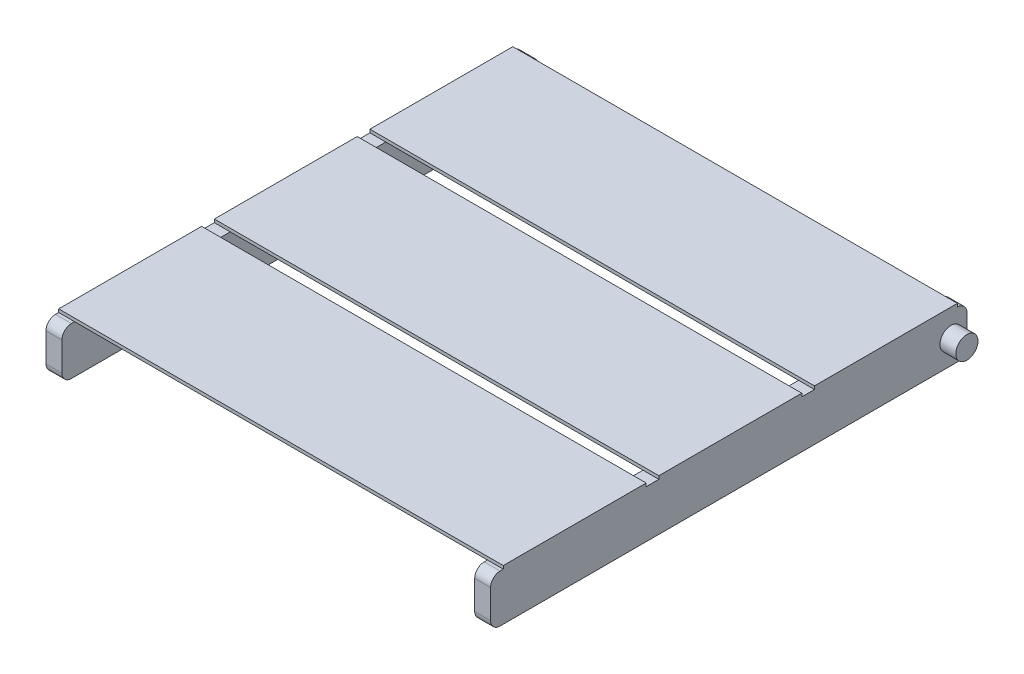
ISO-10303-21;
HEADER;
FILE_DESCRIPTION(('STEP AP214'),'2;1');
FILE_NAME('part.step','',(''),(''),'','','');
FILE_SCHEMA(('AUTOMOTIVE_DESIGN { 1 0 10303 214 1 1 1 1 }'));
ENDSEC;
DATA;
#1=APPLICATION_CONTEXT('core data for automotive mechanical design processes');
#2=APPLICATION_PROTOCOL_DEFINITION('international standard','automotive_design',2000,#1);
#3=PRODUCT_CONTEXT('',#1,'mechanical');
#4=PRODUCT('Part','Part','',(#3));
#5=PRODUCT_RELATED_PRODUCT_CATEGORY('part','',(#4));
#6=PRODUCT_DEFINITION_FORMATION('','',#4);
#7=PRODUCT_DEFINITION_CONTEXT('part definition',#1,'design');
#8=PRODUCT_DEFINITION('design','',#6,#7);
#9=PRODUCT_DEFINITION_SHAPE('','',#8);
#10=(LENGTH_UNIT() NAMED_UNIT(*) SI_UNIT(.MILLI.,.METRE.));
#11=(NAMED_UNIT(*) PLANE_ANGLE_UNIT() SI_UNIT($,.RADIAN.));
#12=(NAMED_UNIT(*) SI_UNIT($,.STERADIAN.) SOLID_ANGLE_UNIT());
#13=UNCERTAINTY_MEASURE_WITH_UNIT(LENGTH_MEASURE(1.E-05),#10,'distance_accuracy_value','');
#14=(GEOMETRIC_REPRESENTATION_CONTEXT(3) GLOBAL_UNCERTAINTY_ASSIGNED_CONTEXT((#13)) GLOBAL_UNIT_ASSIGNED_CONTEXT((#10,
#11,#12)) REPRESENTATION_CONTEXT('',''));
#15=CARTESIAN_POINT('',(0.,0.,0.));
#16=DIRECTION('',(0.,0.,1.));
#17=DIRECTION('',(1.,0.,0.));
#18=AXIS2_PLACEMENT_3D('',#15,#16,#17);
#19=CARTESIAN_POINT('',(50.,75.,720.));
#20=DIRECTION('',(0.,-1.,0.));
#21=DIRECTION('',(0.,0.,-1.));
#22=AXIS2_PLACEMENT_3D('',#19,#20,#21);
#23=PLANE('',#22);
#24=DIRECTION('',(1.,0.,0.));
#25=VECTOR('',#24,1.);
#26=CARTESIAN_POINT('',(1400.,75.,710.));
#27=LINE('',#26,#25);
#28=CARTESIAN_POINT('',(0.,75.,710.));
#29=VERTEX_POINT('',#28);
#30=CARTESIAN_POINT('',(50.,75.,710.000000000001));
#31=VERTEX_POINT('',#30);
#32=EDGE_CURVE('E781',#29,#31,#27,.T.);
#33=ORIENTED_EDGE('',*,*,#32,.F.);
#34=DIRECTION('',(0.,0.,1.));
#35=VECTOR('',#34,1.);
#36=CARTESIAN_POINT('',(0.,75.,720.));
#37=LINE('',#36,#35);
#38=CARTESIAN_POINT('',(0.,75.,720.));
#39=VERTEX_POINT('',#38);
#40=EDGE_CURVE('E280',#29,#39,#37,.T.);
#41=ORIENTED_EDGE('',*,*,#40,.T.);
#42=DIRECTION('',(-1.,0.,0.));
#43=VECTOR('',#42,1.);
#44=CARTESIAN_POINT('',(50.,75.,720.));
#45=LINE('',#44,#43);
#46=CARTESIAN_POINT('',(50.,75.,720.));
#47=VERTEX_POINT('',#46);
#48=EDGE_CURVE('E529',#47,#39,#45,.T.);
#49=ORIENTED_EDGE('',*,*,#48,.F.);
#50=DIRECTION('',(0.,0.,1.));
#51=VECTOR('',#50,1.);
#52=CARTESIAN_POINT('',(50.,75.,720.));
#53=LINE('',#52,#51);
#54=EDGE_CURVE('E57',#31,#47,#53,.T.);
#55=ORIENTED_EDGE('',*,*,#54,.F.);
#56=EDGE_LOOP('',(#33,#41,#49,#55));
#57=FACE_BOUND('',#56,.T.);
#58=ADVANCED_FACE('F41',(#57),#23,.F.);
#59=DIRECTION('',(-1.,0.,0.));
#60=VECTOR('',#59,1.);
#61=CARTESIAN_POINT('',(1400.,75.,260.));
#62=LINE('',#61,#60);
#63=CARTESIAN_POINT('',(50.,75.,260.));
#64=VERTEX_POINT('',#63);
#65=CARTESIAN_POINT('',(0.,75.,260.));
#66=VERTEX_POINT('',#65);
#67=EDGE_CURVE('E65',#64,#66,#62,.T.);
#68=ORIENTED_EDGE('',*,*,#67,.F.);
#69=CARTESIAN_POINT('',(50.,75.,220.000000000001));
#70=VERTEX_POINT('',#69);
#71=EDGE_CURVE('E601',#70,#64,#53,.T.);
#72=ORIENTED_EDGE('',*,*,#71,.F.);
#73=DIRECTION('',(1.,0.,0.));
#74=VECTOR('',#73,1.);
#75=CARTESIAN_POINT('',(1400.,75.,220.));
#76=LINE('',#75,#74);
#77=CARTESIAN_POINT('',(0.,75.,220.));
#78=VERTEX_POINT('',#77);
#79=EDGE_CURVE('E307',#78,#70,#76,.T.);
#80=ORIENTED_EDGE('',*,*,#79,.F.);
#81=EDGE_CURVE('E503',#78,#66,#37,.T.);
#82=ORIENTED_EDGE('',*,*,#81,.T.);
#83=EDGE_LOOP('',(#68,#72,#80,#82));
#84=FACE_BOUND('',#83,.T.);
#85=ADVANCED_FACE('F568',(#84),#23,.F.);
#86=CARTESIAN_POINT('',(1400.,75.,720.));
#87=DIRECTION('',(0.,-1.,0.));
#88=DIRECTION('',(0.,0.,-1.));
#89=AXIS2_PLACEMENT_3D('',#86,#87,#88);
#90=PLANE('',#89);
#91=CARTESIAN_POINT('',(1350.,75.,710.));
#92=VERTEX_POINT('',#91);
#93=CARTESIAN_POINT('',(1400.,75.,710.));
#94=VERTEX_POINT('',#93);
#95=EDGE_CURVE('E774',#92,#94,#27,.T.);
#96=ORIENTED_EDGE('',*,*,#95,.F.);
#97=DIRECTION('',(0.,0.,1.));
#98=VECTOR('',#97,1.);
#99=CARTESIAN_POINT('',(1350.,75.,720.));
#100=LINE('',#99,#98);
#101=CARTESIAN_POINT('',(1350.,75.,720.));
#102=VERTEX_POINT('',#101);
#103=EDGE_CURVE('E378',#92,#102,#100,.T.);
#104=ORIENTED_EDGE('',*,*,#103,.T.);
#105=DIRECTION('',(-1.,0.,0.));
#106=VECTOR('',#105,1.);
#107=CARTESIAN_POINT('',(1400.,75.,720.));
#108=LINE('',#107,#106);
#109=CARTESIAN_POINT('',(1400.,75.,720.));
#110=VERTEX_POINT('',#109);
#111=EDGE_CURVE('E409',#110,#102,#108,.T.);
#112=ORIENTED_EDGE('',*,*,#111,.F.);
#113=DIRECTION('',(0.,0.,1.));
#114=VECTOR('',#113,1.);
#115=CARTESIAN_POINT('',(1400.,75.,720.));
#116=LINE('',#115,#114);
#117=EDGE_CURVE('E349',#94,#110,#116,.T.);
#118=ORIENTED_EDGE('',*,*,#117,.F.);
#119=EDGE_LOOP('',(#96,#104,#112,#118));
#120=FACE_BOUND('',#119,.T.);
#121=ADVANCED_FACE('F574',(#120),#90,.F.);
#122=CARTESIAN_POINT('',(1400.,75.,260.));
#123=VERTEX_POINT('',#122);
#124=CARTESIAN_POINT('',(1350.,75.,260.));
#125=VERTEX_POINT('',#124);
#126=EDGE_CURVE('E275',#123,#125,#62,.T.);
#127=ORIENTED_EDGE('',*,*,#126,.F.);
#128=CARTESIAN_POINT('',(1400.,75.,220.));
#129=VERTEX_POINT('',#128);
#130=EDGE_CURVE('E355',#129,#123,#116,.T.);
#131=ORIENTED_EDGE('',*,*,#130,.F.);
#132=CARTESIAN_POINT('',(1350.,75.,220.));
#133=VERTEX_POINT('',#132);
#134=EDGE_CURVE('E286',#133,#129,#76,.T.);
#135=ORIENTED_EDGE('',*,*,#134,.F.);
#136=EDGE_CURVE('E818',#133,#125,#100,.T.);
#137=ORIENTED_EDGE('',*,*,#136,.T.);
#138=EDGE_LOOP('',(#127,#131,#135,#137));
#139=FACE_BOUND('',#138,.T.);
#140=ADVANCED_FACE('F579',(#139),#90,.F.);
#141=DIRECTION('',(-1.,0.,0.));
#142=VECTOR('',#141,1.);
#143=CARTESIAN_POINT('',(1400.,75.,-230.));
#144=LINE('',#143,#142);
#145=CARTESIAN_POINT('',(50.,75.,-230.));
#146=VERTEX_POINT('',#145);
#147=CARTESIAN_POINT('',(0.,75.,-230.));
#148=VERTEX_POINT('',#147);
#149=EDGE_CURVE('E311',#146,#148,#144,.T.);
#150=ORIENTED_EDGE('',*,*,#149,.F.);
#151=CARTESIAN_POINT('',(50.,75.,-269.999999999999));
#152=VERTEX_POINT('',#151);
#153=EDGE_CURVE('E477',#152,#146,#53,.T.);
#154=ORIENTED_EDGE('',*,*,#153,.F.);
#155=DIRECTION('',(1.,0.,0.));
#156=VECTOR('',#155,1.);
#157=CARTESIAN_POINT('',(1400.,75.,-270.));
#158=LINE('',#157,#156);
#159=CARTESIAN_POINT('',(0.,75.,-270.));
#160=VERTEX_POINT('',#159);
#161=EDGE_CURVE('E437',#160,#152,#158,.T.);
#162=ORIENTED_EDGE('',*,*,#161,.F.);
#163=EDGE_CURVE('E499',#160,#148,#37,.T.);
#164=ORIENTED_EDGE('',*,*,#163,.T.);
#165=EDGE_LOOP('',(#150,#154,#162,#164));
#166=FACE_BOUND('',#165,.T.);
#167=ADVANCED_FACE('F570',(#166),#23,.F.);
#168=CARTESIAN_POINT('',(1400.,75.,-230.));
#169=VERTEX_POINT('',#168);
#170=CARTESIAN_POINT('',(1350.,75.,-230.));
#171=VERTEX_POINT('',#170);
#172=EDGE_CURVE('E297',#169,#171,#144,.T.);
#173=ORIENTED_EDGE('',*,*,#172,.F.);
#174=CARTESIAN_POINT('',(1400.,75.,-270.));
#175=VERTEX_POINT('',#174);
#176=EDGE_CURVE('E350',#175,#169,#116,.T.);
#177=ORIENTED_EDGE('',*,*,#176,.F.);
#178=CARTESIAN_POINT('',(1350.,75.,-270.));
#179=VERTEX_POINT('',#178);
#180=EDGE_CURVE('E421',#179,#175,#158,.T.);
#181=ORIENTED_EDGE('',*,*,#180,.F.);
#182=EDGE_CURVE('E383',#179,#171,#100,.T.);
#183=ORIENTED_EDGE('',*,*,#182,.T.);
#184=EDGE_LOOP('',(#173,#177,#181,#183));
#185=FACE_BOUND('',#184,.T.);
#186=ADVANCED_FACE('F578',(#185),#90,.F.);
#187=CARTESIAN_POINT('',(0.,75.,0.));
#188=DIRECTION('',(0.,1.,0.));
#189=DIRECTION('',(0.,0.,1.));
#190=AXIS2_PLACEMENT_3D('',#187,#188,#189);
#191=PLANE('',#190);
#192=CARTESIAN_POINT('',(1350.,75.,-720.));
#193=VERTEX_POINT('',#192);
#194=EDGE_CURVE('E379',#193,#179,#100,.T.);
#195=ORIENTED_EDGE('',*,*,#194,.T.);
#196=EDGE_CURVE('E442',#152,#179,#158,.T.);
#197=ORIENTED_EDGE('',*,*,#196,.F.);
#198=CARTESIAN_POINT('',(50.,75.,-720.));
#199=VERTEX_POINT('',#198);
#200=EDGE_CURVE('E472',#199,#152,#53,.T.);
#201=ORIENTED_EDGE('',*,*,#200,.F.);
#202=DIRECTION('',(-1.,0.,0.));
#203=VECTOR('',#202,1.);
#204=CARTESIAN_POINT('',(1400.,75.,-720.));
#205=LINE('',#204,#203);
#206=EDGE_CURVE('E441',#193,#199,#205,.T.);
#207=ORIENTED_EDGE('',*,*,#206,.F.);
#208=EDGE_LOOP('',(#195,#197,#201,#207));
#209=FACE_BOUND('',#208,.T.);
#210=ADVANCED_FACE('F585',(#209),#191,.F.);
#211=CARTESIAN_POINT('',(50.,-45.,-720.));
#212=DIRECTION('',(-1.,0.,0.));
#213=DIRECTION('',(0.,0.,1.));
#214=AXIS2_PLACEMENT_3D('',#211,#212,#213);
#215=CYLINDRICAL_SURFACE('',#214,30.);
#216=CARTESIAN_POINT('',(0.,-45.,-720.));
#217=DIRECTION('',(1.,0.,0.));
#218=DIRECTION('',(0.,0.,-1.));
#219=AXIS2_PLACEMENT_3D('',#216,#217,#218);
#220=CIRCLE('',#219,30.);
#221=CARTESIAN_POINT('',(0.,-75.,-720.));
#222=VERTEX_POINT('',#221);
#223=CARTESIAN_POINT('',(0.,-44.9999999999998,-750.));
#224=VERTEX_POINT('',#223);
#225=EDGE_CURVE('E459',#222,#224,#220,.T.);
#226=ORIENTED_EDGE('',*,*,#225,.T.);
#227=DIRECTION('',(-1.,0.,0.));
#228=VECTOR('',#227,1.);
#229=CARTESIAN_POINT('',(50.,-44.9999999999998,-750.));
#230=LINE('',#229,#228);
#231=CARTESIAN_POINT('',(50.,-44.9999999999998,-750.));
#232=VERTEX_POINT('',#231);
#233=EDGE_CURVE('E541',#232,#224,#230,.T.);
#234=ORIENTED_EDGE('',*,*,#233,.F.);
#235=CARTESIAN_POINT('',(50.,-45.,-720.));
#236=DIRECTION('',(1.,0.,0.));
#237=DIRECTION('',(0.,0.,-1.));
#238=AXIS2_PLACEMENT_3D('',#235,#236,#237);
#239=CIRCLE('',#238,30.);
#240=CARTESIAN_POINT('',(50.,-75.,-720.));
#241=VERTEX_POINT('',#240);
#242=EDGE_CURVE('E460',#241,#232,#239,.T.);
#243=ORIENTED_EDGE('',*,*,#242,.F.);
#244=DIRECTION('',(-1.,0.,0.));
#245=VECTOR('',#244,1.);
#246=CARTESIAN_POINT('',(50.,-75.,-720.));
#247=LINE('',#246,#245);
#248=EDGE_CURVE('E489',#241,#222,#247,.T.);
#249=ORIENTED_EDGE('',*,*,#248,.T.);
#250=EDGE_LOOP('',(#226,#234,#243,#249));
#251=FACE_BOUND('',#250,.T.);
#252=ADVANCED_FACE('F43',(#251),#215,.T.);
#253=CARTESIAN_POINT('',(50.,-44.9999999999998,-750.));
#254=DIRECTION('',(0.,0.,1.));
#255=DIRECTION('',(1.,0.,0.));
#256=AXIS2_PLACEMENT_3D('',#253,#254,#255);
#257=PLANE('',#256);
#258=DIRECTION('',(0.,1.,0.));
#259=VECTOR('',#258,1.);
#260=CARTESIAN_POINT('',(0.,-44.9999999999998,-750.));
#261=LINE('',#260,#259);
#262=CARTESIAN_POINT('',(0.,44.9999999999998,-750.));
#263=VERTEX_POINT('',#262);
#264=EDGE_CURVE('E493',#224,#263,#261,.T.);
#265=ORIENTED_EDGE('',*,*,#264,.T.);
#266=DIRECTION('',(-1.,0.,0.));
#267=VECTOR('',#266,1.);
#268=CARTESIAN_POINT('',(50.,44.9999999999998,-750.));
#269=LINE('',#268,#267);
#270=CARTESIAN_POINT('',(50.,44.9999999999998,-750.));
#271=VERTEX_POINT('',#270);
#272=EDGE_CURVE('E537',#271,#263,#269,.T.);
#273=ORIENTED_EDGE('',*,*,#272,.F.);
#274=DIRECTION('',(0.,1.,0.));
#275=VECTOR('',#274,1.);
#276=CARTESIAN_POINT('',(50.,-44.9999999999998,-750.));
#277=LINE('',#276,#275);
#278=EDGE_CURVE('E464',#232,#271,#277,.T.);
#279=ORIENTED_EDGE('',*,*,#278,.F.);
#280=ORIENTED_EDGE('',*,*,#233,.T.);
#281=EDGE_LOOP('',(#265,#273,#279,#280));
#282=FACE_BOUND('',#281,.T.);
#283=ADVANCED_FACE('F660',(#282),#257,.F.);
#284=CARTESIAN_POINT('',(50.,45.,-720.));
#285=DIRECTION('',(-1.,0.,0.));
#286=DIRECTION('',(0.,0.,1.));
#287=AXIS2_PLACEMENT_3D('',#284,#285,#286);
#288=CYLINDRICAL_SURFACE('',#287,30.);
#289=CARTESIAN_POINT('',(0.,45.,-720.));
#290=DIRECTION('',(1.,0.,0.));
#291=DIRECTION('',(0.,0.,1.));
#292=AXIS2_PLACEMENT_3D('',#289,#290,#291);
#293=CIRCLE('',#292,30.);
#294=CARTESIAN_POINT('',(0.,75.,-720.));
#295=VERTEX_POINT('',#294);
#296=EDGE_CURVE('E496',#263,#295,#293,.T.);
#297=ORIENTED_EDGE('',*,*,#296,.T.);
#298=DIRECTION('',(-1.,0.,0.));
#299=VECTOR('',#298,1.);
#300=CARTESIAN_POINT('',(50.,75.,-720.));
#301=LINE('',#300,#299);
#302=EDGE_CURVE('E533',#199,#295,#301,.T.);
#303=ORIENTED_EDGE('',*,*,#302,.F.);
#304=CARTESIAN_POINT('',(50.,45.,-720.));
#305=DIRECTION('',(1.,0.,0.));
#306=DIRECTION('',(0.,0.,1.));
#307=AXIS2_PLACEMENT_3D('',#304,#305,#306);
#308=CIRCLE('',#307,30.);
#309=EDGE_CURVE('E468',#271,#199,#308,.T.);
#310=ORIENTED_EDGE('',*,*,#309,.F.);
#311=ORIENTED_EDGE('',*,*,#272,.T.);
#312=EDGE_LOOP('',(#297,#303,#310,#311));
#313=FACE_BOUND('',#312,.T.);
#314=ADVANCED_FACE('F663',(#313),#288,.T.);
#315=CARTESIAN_POINT('',(50.,45.,720.));
#316=DIRECTION('',(-1.,0.,0.));
#317=DIRECTION('',(0.,0.,1.));
#318=AXIS2_PLACEMENT_3D('',#315,#316,#317);
#319=CYLINDRICAL_SURFACE('',#318,30.);
#320=CARTESIAN_POINT('',(0.,45.,720.));
#321=DIRECTION('',(1.,0.,0.));
#322=DIRECTION('',(0.,0.,1.));
#323=AXIS2_PLACEMENT_3D('',#320,#321,#322);
#324=CIRCLE('',#323,30.);
#325=CARTESIAN_POINT('',(0.,44.9999999999998,750.));
#326=VERTEX_POINT('',#325);
#327=EDGE_CURVE('E502',#39,#326,#324,.T.);
#328=ORIENTED_EDGE('',*,*,#327,.T.);
#329=DIRECTION('',(-1.,0.,0.));
#330=VECTOR('',#329,1.);
#331=CARTESIAN_POINT('',(50.,44.9999999999998,750.));
#332=LINE('',#331,#330);
#333=CARTESIAN_POINT('',(50.,44.9999999999998,750.));
#334=VERTEX_POINT('',#333);
#335=EDGE_CURVE('E525',#334,#326,#332,.T.);
#336=ORIENTED_EDGE('',*,*,#335,.F.);
#337=CARTESIAN_POINT('',(50.,45.,720.));
#338=DIRECTION('',(1.,0.,0.));
#339=DIRECTION('',(0.,0.,1.));
#340=AXIS2_PLACEMENT_3D('',#337,#338,#339);
#341=CIRCLE('',#340,30.);
#342=EDGE_CURVE('E476',#47,#334,#341,.T.);
#343=ORIENTED_EDGE('',*,*,#342,.F.);
#344=ORIENTED_EDGE('',*,*,#48,.T.);
#345=EDGE_LOOP('',(#328,#336,#343,#344));
#346=FACE_BOUND('',#345,.T.);
#347=ADVANCED_FACE('F638',(#346),#319,.T.);
#348=CARTESIAN_POINT('',(50.,-44.9999999999998,750.));
#349=DIRECTION('',(0.,0.,-1.));
#350=DIRECTION('',(-1.,0.,0.));
#351=AXIS2_PLACEMENT_3D('',#348,#349,#350);
#352=PLANE('',#351);
#353=DIRECTION('',(0.,-1.,0.));
#354=VECTOR('',#353,1.);
#355=CARTESIAN_POINT('',(0.,-44.9999999999998,750.));
#356=LINE('',#355,#354);
#357=CARTESIAN_POINT('',(0.,-45.,750.));
#358=VERTEX_POINT('',#357);
#359=EDGE_CURVE('E506',#326,#358,#356,.T.);
#360=ORIENTED_EDGE('',*,*,#359,.T.);
#361=DIRECTION('',(-1.,0.,0.));
#362=VECTOR('',#361,1.);
#363=CARTESIAN_POINT('',(50.,-45.,750.));
#364=LINE('',#363,#362);
#365=CARTESIAN_POINT('',(50.,-45.,750.));
#366=VERTEX_POINT('',#365);
#367=EDGE_CURVE('E521',#366,#358,#364,.T.);
#368=ORIENTED_EDGE('',*,*,#367,.F.);
#369=DIRECTION('',(0.,-1.,0.));
#370=VECTOR('',#369,1.);
#371=CARTESIAN_POINT('',(50.,-44.9999999999998,750.));
#372=LINE('',#371,#370);
#373=EDGE_CURVE('E480',#334,#366,#372,.T.);
#374=ORIENTED_EDGE('',*,*,#373,.F.);
#375=ORIENTED_EDGE('',*,*,#335,.T.);
#376=EDGE_LOOP('',(#360,#368,#374,#375));
#377=FACE_BOUND('',#376,.T.);
#378=ADVANCED_FACE('F643',(#377),#352,.F.);
#379=CARTESIAN_POINT('',(50.,-45.,720.));
#380=DIRECTION('',(-1.,0.,0.));
#381=DIRECTION('',(0.,0.,1.));
#382=AXIS2_PLACEMENT_3D('',#379,#380,#381);
#383=CYLINDRICAL_SURFACE('',#382,30.);
#384=CARTESIAN_POINT('',(0.,-45.,720.));
#385=DIRECTION('',(1.,0.,0.));
#386=DIRECTION('',(0.,0.,1.));
#387=AXIS2_PLACEMENT_3D('',#384,#385,#386);
#388=CIRCLE('',#387,30.);
#389=CARTESIAN_POINT('',(0.,-75.,720.));
#390=VERTEX_POINT('',#389);
#391=EDGE_CURVE('E509',#358,#390,#388,.T.);
#392=ORIENTED_EDGE('',*,*,#391,.T.);
#393=DIRECTION('',(-1.,0.,0.));
#394=VECTOR('',#393,1.);
#395=CARTESIAN_POINT('',(50.,-75.,720.));
#396=LINE('',#395,#394);
#397=CARTESIAN_POINT('',(50.,-75.,720.));
#398=VERTEX_POINT('',#397);
#399=EDGE_CURVE('E517',#398,#390,#396,.T.);
#400=ORIENTED_EDGE('',*,*,#399,.F.);
#401=CARTESIAN_POINT('',(50.,-45.,720.));
#402=DIRECTION('',(1.,0.,0.));
#403=DIRECTION('',(0.,0.,1.));
#404=AXIS2_PLACEMENT_3D('',#401,#402,#403);
#405=CIRCLE('',#404,30.);
#406=EDGE_CURVE('E483',#366,#398,#405,.T.);
#407=ORIENTED_EDGE('',*,*,#406,.F.);
#408=ORIENTED_EDGE('',*,*,#367,.T.);
#409=EDGE_LOOP('',(#392,#400,#407,#408));
#410=FACE_BOUND('',#409,.T.);
#411=ADVANCED_FACE('F649',(#410),#383,.T.);
#412=CARTESIAN_POINT('',(50.,-75.,720.));
#413=DIRECTION('',(0.,1.,0.));
#414=DIRECTION('',(0.,0.,1.));
#415=AXIS2_PLACEMENT_3D('',#412,#413,#414);
#416=PLANE('',#415);
#417=DIRECTION('',(0.,0.,-1.));
#418=VECTOR('',#417,1.);
#419=CARTESIAN_POINT('',(0.,-75.,720.));
#420=LINE('',#419,#418);
#421=EDGE_CURVE('E465',#390,#222,#420,.T.);
#422=ORIENTED_EDGE('',*,*,#421,.T.);
#423=ORIENTED_EDGE('',*,*,#248,.F.);
#424=DIRECTION('',(0.,0.,-1.));
#425=VECTOR('',#424,1.);
#426=CARTESIAN_POINT('',(50.,-75.,720.));
#427=LINE('',#426,#425);
#428=EDGE_CURVE('E486',#398,#241,#427,.T.);
#429=ORIENTED_EDGE('',*,*,#428,.F.);
#430=ORIENTED_EDGE('',*,*,#399,.T.);
#431=EDGE_LOOP('',(#422,#423,#429,#430));
#432=FACE_BOUND('',#431,.T.);
#433=ADVANCED_FACE('F563',(#432),#416,.F.);
#434=CARTESIAN_POINT('',(50.,-45.,-720.));
#435=DIRECTION('',(1.,0.,0.));
#436=DIRECTION('',(0.,0.,-1.));
#437=AXIS2_PLACEMENT_3D('',#434,#435,#436);
#438=PLANE('',#437);
#439=ORIENTED_EDGE('',*,*,#242,.T.);
#440=ORIENTED_EDGE('',*,*,#278,.T.);
#441=ORIENTED_EDGE('',*,*,#309,.T.);
#442=ORIENTED_EDGE('',*,*,#200,.T.);
#443=ORIENTED_EDGE('',*,*,#153,.T.);
#444=DIRECTION('',(0.,0.,1.));
#445=VECTOR('',#444,1.);
#446=CARTESIAN_POINT('',(50.,75.,-720.));
#447=LINE('',#446,#445);
#448=EDGE_CURVE('E332',#146,#70,#447,.T.);
#449=ORIENTED_EDGE('',*,*,#448,.T.);
#450=ORIENTED_EDGE('',*,*,#71,.T.);
#451=DIRECTION('',(0.,0.,1.));
#452=VECTOR('',#451,1.);
#453=CARTESIAN_POINT('',(50.,75.,-720.));
#454=LINE('',#453,#452);
#455=EDGE_CURVE('E282',#64,#31,#454,.T.);
#456=ORIENTED_EDGE('',*,*,#455,.T.);
#457=ORIENTED_EDGE('',*,*,#54,.T.);
#458=ORIENTED_EDGE('',*,*,#342,.T.);
#459=ORIENTED_EDGE('',*,*,#373,.T.);
#460=ORIENTED_EDGE('',*,*,#406,.T.);
#461=ORIENTED_EDGE('',*,*,#428,.T.);
#462=EDGE_LOOP('',(#439,#440,#441,#442,#443,#449,#450,#456,#457,#458,#459,#460,#461));
#463=FACE_BOUND('',#462,.T.);
#464=ADVANCED_FACE('F552',(#463),#438,.T.);
#465=CARTESIAN_POINT('',(0.,-45.,-720.));
#466=DIRECTION('',(1.,0.,0.));
#467=DIRECTION('',(0.,0.,-1.));
#468=AXIS2_PLACEMENT_3D('',#465,#466,#467);
#469=PLANE('',#468);
#470=CARTESIAN_POINT('',(0.,0.,-700.));
#471=DIRECTION('',(1.,0.,0.));
#472=DIRECTION('',(0.,0.,-1.));
#473=AXIS2_PLACEMENT_3D('',#470,#471,#472);
#474=CIRCLE('',#473,35.);
#475=CARTESIAN_POINT('',(0.,0.,-735.));
#476=VERTEX_POINT('',#475);
#477=EDGE_CURVE('E50',#476,#476,#474,.F.);
#478=ORIENTED_EDGE('',*,*,#477,.F.);
#479=EDGE_LOOP('',(#478));
#480=FACE_BOUND('',#479,.T.);
#481=ORIENTED_EDGE('',*,*,#225,.F.);
#482=ORIENTED_EDGE('',*,*,#421,.F.);
#483=ORIENTED_EDGE('',*,*,#391,.F.);
#484=ORIENTED_EDGE('',*,*,#359,.F.);
#485=ORIENTED_EDGE('',*,*,#327,.F.);
#486=ORIENTED_EDGE('',*,*,#40,.F.);
#487=DIRECTION('',(0.,-1.,0.));
#488=VECTOR('',#487,1.);
#489=CARTESIAN_POINT('',(0.,85.,710.));
#490=LINE('',#489,#488);
#491=CARTESIAN_POINT('',(0.,85.,710.));
#492=VERTEX_POINT('',#491);
#493=EDGE_CURVE('E257',#492,#29,#490,.T.);
#494=ORIENTED_EDGE('',*,*,#493,.F.);
#495=DIRECTION('',(0.,0.,1.));
#496=VECTOR('',#495,1.);
#497=CARTESIAN_POINT('',(0.,85.,710.));
#498=LINE('',#497,#496);
#499=CARTESIAN_POINT('',(0.,85.,260.));
#500=VERTEX_POINT('',#499);
#501=EDGE_CURVE('E265',#500,#492,#498,.T.);
#502=ORIENTED_EDGE('',*,*,#501,.F.);
#503=DIRECTION('',(0.,-1.,0.));
#504=VECTOR('',#503,1.);
#505=CARTESIAN_POINT('',(0.,85.,260.));
#506=LINE('',#505,#504);
#507=EDGE_CURVE('E629',#500,#66,#506,.T.);
#508=ORIENTED_EDGE('',*,*,#507,.T.);
#509=ORIENTED_EDGE('',*,*,#81,.F.);
#510=DIRECTION('',(0.,-1.,0.));
#511=VECTOR('',#510,1.);
#512=CARTESIAN_POINT('',(0.,85.,220.));
#513=LINE('',#512,#511);
#514=CARTESIAN_POINT('',(0.,85.,220.));
#515=VERTEX_POINT('',#514);
#516=EDGE_CURVE('E328',#515,#78,#513,.T.);
#517=ORIENTED_EDGE('',*,*,#516,.F.);
#518=DIRECTION('',(0.,0.,1.));
#519=VECTOR('',#518,1.);
#520=CARTESIAN_POINT('',(0.,85.,220.));
#521=LINE('',#520,#519);
#522=CARTESIAN_POINT('',(0.,85.,-230.));
#523=VERTEX_POINT('',#522);
#524=EDGE_CURVE('E292',#523,#515,#521,.T.);
#525=ORIENTED_EDGE('',*,*,#524,.F.);
#526=DIRECTION('',(0.,-1.,0.));
#527=VECTOR('',#526,1.);
#528=CARTESIAN_POINT('',(0.,85.,-230.));
#529=LINE('',#528,#527);
#530=EDGE_CURVE('E306',#523,#148,#529,.T.);
#531=ORIENTED_EDGE('',*,*,#530,.T.);
#532=ORIENTED_EDGE('',*,*,#163,.F.);
#533=DIRECTION('',(0.,-1.,0.));
#534=VECTOR('',#533,1.);
#535=CARTESIAN_POINT('',(0.,85.,-270.));
#536=LINE('',#535,#534);
#537=CARTESIAN_POINT('',(0.,85.,-270.));
#538=VERTEX_POINT('',#537);
#539=EDGE_CURVE('E455',#538,#160,#536,.T.);
#540=ORIENTED_EDGE('',*,*,#539,.F.);
#541=DIRECTION('',(0.,0.,1.));
#542=VECTOR('',#541,1.);
#543=CARTESIAN_POINT('',(0.,85.,-270.));
#544=LINE('',#543,#542);
#545=CARTESIAN_POINT('',(0.,85.,-720.));
#546=VERTEX_POINT('',#545);
#547=EDGE_CURVE('E422',#546,#538,#544,.T.);
#548=ORIENTED_EDGE('',*,*,#547,.F.);
#549=DIRECTION('',(0.,-1.,0.));
#550=VECTOR('',#549,1.);
#551=CARTESIAN_POINT('',(0.,85.,-720.));
#552=LINE('',#551,#550);
#553=EDGE_CURVE('E436',#546,#295,#552,.T.);
#554=ORIENTED_EDGE('',*,*,#553,.T.);
#555=ORIENTED_EDGE('',*,*,#296,.F.);
#556=ORIENTED_EDGE('',*,*,#264,.F.);
#557=EDGE_LOOP('',(#481,#482,#483,#484,#485,#486,#494,#502,#508,#509,#517,#525,#531,#532,#540,
#548,#554,#555,#556));
#558=FACE_BOUND('',#557,.T.);
#559=ADVANCED_FACE('F278',(#480,#558),#469,.F.);
#560=CARTESIAN_POINT('',(1400.,85.,-270.));
#561=DIRECTION('',(0.,0.,-1.));
#562=DIRECTION('',(-1.,0.,0.));
#563=AXIS2_PLACEMENT_3D('',#560,#561,#562);
#564=PLANE('',#563);
#565=ORIENTED_EDGE('',*,*,#161,.T.);
#566=ORIENTED_EDGE('',*,*,#196,.T.);
#567=ORIENTED_EDGE('',*,*,#180,.T.);
#568=DIRECTION('',(0.,-1.,0.));
#569=VECTOR('',#568,1.);
#570=CARTESIAN_POINT('',(1400.,85.,-270.));
#571=LINE('',#570,#569);
#572=CARTESIAN_POINT('',(1400.,85.,-270.));
#573=VERTEX_POINT('',#572);
#574=EDGE_CURVE('E451',#573,#175,#571,.T.);
#575=ORIENTED_EDGE('',*,*,#574,.F.);
#576=DIRECTION('',(1.,0.,0.));
#577=VECTOR('',#576,1.);
#578=CARTESIAN_POINT('',(1400.,85.,-270.));
#579=LINE('',#578,#577);
#580=EDGE_CURVE('E426',#538,#573,#579,.T.);
#581=ORIENTED_EDGE('',*,*,#580,.F.);
#582=ORIENTED_EDGE('',*,*,#539,.T.);
#583=EDGE_LOOP('',(#565,#566,#567,#575,#581,#582));
#584=FACE_BOUND('',#583,.T.);
#585=ADVANCED_FACE('F551',(#584),#564,.F.);
#586=CARTESIAN_POINT('',(1400.,85.,-270.));
#587=DIRECTION('',(-1.,0.,0.));
#588=DIRECTION('',(0.,0.,1.));
#589=AXIS2_PLACEMENT_3D('',#586,#587,#588);
#590=PLANE('',#589);
#591=CARTESIAN_POINT('',(1400.,0.,-700.));
#592=DIRECTION('',(-1.,0.,0.));
#593=DIRECTION('',(0.,0.,1.));
#594=AXIS2_PLACEMENT_3D('',#591,#592,#593);
#595=CIRCLE('',#594,35.);
#596=CARTESIAN_POINT('',(1400.,0.,-665.));
#597=VERTEX_POINT('',#596);
#598=EDGE_CURVE('E11',#597,#597,#595,.F.);
#599=ORIENTED_EDGE('',*,*,#598,.F.);
#600=EDGE_LOOP('',(#599));
#601=FACE_BOUND('',#600,.T.);
#602=ORIENTED_EDGE('',*,*,#574,.T.);
#603=ORIENTED_EDGE('',*,*,#176,.T.);
#604=DIRECTION('',(0.,-1.,0.));
#605=VECTOR('',#604,1.);
#606=CARTESIAN_POINT('',(1400.,85.,-230.));
#607=LINE('',#606,#605);
#608=CARTESIAN_POINT('',(1400.,85.,-230.));
#609=VERTEX_POINT('',#608);
#610=EDGE_CURVE('E320',#609,#169,#607,.T.);
#611=ORIENTED_EDGE('',*,*,#610,.F.);
#612=DIRECTION('',(0.,0.,-1.));
#613=VECTOR('',#612,1.);
#614=CARTESIAN_POINT('',(1400.,85.,220.));
#615=LINE('',#614,#613);
#616=CARTESIAN_POINT('',(1400.,85.,220.));
#617=VERTEX_POINT('',#616);
#618=EDGE_CURVE('E300',#617,#609,#615,.T.);
#619=ORIENTED_EDGE('',*,*,#618,.F.);
#620=DIRECTION('',(0.,-1.,0.));
#621=VECTOR('',#620,1.);
#622=CARTESIAN_POINT('',(1400.,85.,220.));
#623=LINE('',#622,#621);
#624=EDGE_CURVE('E324',#617,#129,#623,.T.);
#625=ORIENTED_EDGE('',*,*,#624,.T.);
#626=ORIENTED_EDGE('',*,*,#130,.T.);
#627=DIRECTION('',(0.,-1.,0.));
#628=VECTOR('',#627,1.);
#629=CARTESIAN_POINT('',(1400.,85.,260.));
#630=LINE('',#629,#628);
#631=CARTESIAN_POINT('',(1400.,85.,260.));
#632=VERTEX_POINT('',#631);
#633=EDGE_CURVE('E288',#632,#123,#630,.T.);
#634=ORIENTED_EDGE('',*,*,#633,.F.);
#635=DIRECTION('',(0.,0.,-1.));
#636=VECTOR('',#635,1.);
#637=CARTESIAN_POINT('',(1400.,85.,710.));
#638=LINE('',#637,#636);
#639=CARTESIAN_POINT('',(1400.,85.,710.));
#640=VERTEX_POINT('',#639);
#641=EDGE_CURVE('E264',#640,#632,#638,.T.);
#642=ORIENTED_EDGE('',*,*,#641,.F.);
#643=DIRECTION('',(0.,-1.,0.));
#644=VECTOR('',#643,1.);
#645=CARTESIAN_POINT('',(1400.,85.,710.));
#646=LINE('',#645,#644);
#647=EDGE_CURVE('E260',#640,#94,#646,.T.);
#648=ORIENTED_EDGE('',*,*,#647,.T.);
#649=ORIENTED_EDGE('',*,*,#117,.T.);
#650=CARTESIAN_POINT('',(1400.,45.,720.));
#651=DIRECTION('',(1.,0.,0.));
#652=DIRECTION('',(0.,0.,1.));
#653=AXIS2_PLACEMENT_3D('',#650,#651,#652);
#654=CIRCLE('',#653,30.);
#655=CARTESIAN_POINT('',(1400.,44.9999999999998,750.));
#656=VERTEX_POINT('',#655);
#657=EDGE_CURVE('E354',#110,#656,#654,.T.);
#658=ORIENTED_EDGE('',*,*,#657,.T.);
#659=DIRECTION('',(0.,-1.,0.));
#660=VECTOR('',#659,1.);
#661=CARTESIAN_POINT('',(1400.,-44.9999999999998,750.));
#662=LINE('',#661,#660);
#663=CARTESIAN_POINT('',(1400.,-45.,750.));
#664=VERTEX_POINT('',#663);
#665=EDGE_CURVE('E358',#656,#664,#662,.T.);
#666=ORIENTED_EDGE('',*,*,#665,.T.);
#667=CARTESIAN_POINT('',(1400.,-45.,720.));
#668=DIRECTION('',(1.,0.,0.));
#669=DIRECTION('',(0.,0.,1.));
#670=AXIS2_PLACEMENT_3D('',#667,#668,#669);
#671=CIRCLE('',#670,30.);
#672=CARTESIAN_POINT('',(1400.,-75.,720.));
#673=VERTEX_POINT('',#672);
#674=EDGE_CURVE('E361',#664,#673,#671,.T.);
#675=ORIENTED_EDGE('',*,*,#674,.T.);
#676=DIRECTION('',(0.,0.,-1.));
#677=VECTOR('',#676,1.);
#678=CARTESIAN_POINT('',(1400.,-75.,720.));
#679=LINE('',#678,#677);
#680=CARTESIAN_POINT('',(1400.,-75.,-720.));
#681=VERTEX_POINT('',#680);
#682=EDGE_CURVE('E364',#673,#681,#679,.T.);
#683=ORIENTED_EDGE('',*,*,#682,.T.);
#684=CARTESIAN_POINT('',(1400.,-45.,-720.));
#685=DIRECTION('',(1.,0.,0.));
#686=DIRECTION('',(0.,0.,-1.));
#687=AXIS2_PLACEMENT_3D('',#684,#685,#686);
#688=CIRCLE('',#687,30.);
#689=CARTESIAN_POINT('',(1400.,-44.9999999999998,-750.));
#690=VERTEX_POINT('',#689);
#691=EDGE_CURVE('E337',#681,#690,#688,.T.);
#692=ORIENTED_EDGE('',*,*,#691,.T.);
#693=DIRECTION('',(0.,1.,0.));
#694=VECTOR('',#693,1.);
#695=CARTESIAN_POINT('',(1400.,-44.9999999999998,-750.));
#696=LINE('',#695,#694);
#697=CARTESIAN_POINT('',(1400.,44.9999999999998,-750.));
#698=VERTEX_POINT('',#697);
#699=EDGE_CURVE('E341',#690,#698,#696,.T.);
#700=ORIENTED_EDGE('',*,*,#699,.T.);
#701=CARTESIAN_POINT('',(1400.,45.,-720.));
#702=DIRECTION('',(1.,0.,0.));
#703=DIRECTION('',(0.,0.,1.));
#704=AXIS2_PLACEMENT_3D('',#701,#702,#703);
#705=CIRCLE('',#704,30.);
#706=CARTESIAN_POINT('',(1400.,75.,-720.));
#707=VERTEX_POINT('',#706);
#708=EDGE_CURVE('E345',#698,#707,#705,.T.);
#709=ORIENTED_EDGE('',*,*,#708,.T.);
#710=DIRECTION('',(0.,-1.,0.));
#711=VECTOR('',#710,1.);
#712=CARTESIAN_POINT('',(1400.,85.,-720.));
#713=LINE('',#712,#711);
#714=CARTESIAN_POINT('',(1400.,85.,-720.));
#715=VERTEX_POINT('',#714);
#716=EDGE_CURVE('E448',#715,#707,#713,.T.);
#717=ORIENTED_EDGE('',*,*,#716,.F.);
#718=DIRECTION('',(0.,0.,-1.));
#719=VECTOR('',#718,1.);
#720=CARTESIAN_POINT('',(1400.,85.,-270.));
#721=LINE('',#720,#719);
#722=EDGE_CURVE('E430',#573,#715,#721,.T.);
#723=ORIENTED_EDGE('',*,*,#722,.F.);
#724=EDGE_LOOP('',(#602,#603,#611,#619,#625,#626,#634,#642,#648,#649,#658,#666,#675,#683,#692,
#700,#709,#717,#723));
#725=FACE_BOUND('',#724,.T.);
#726=ADVANCED_FACE('F559',(#601,#725),#590,.F.);
#727=CARTESIAN_POINT('',(1400.,85.,-720.));
#728=DIRECTION('',(0.,0.,1.));
#729=DIRECTION('',(1.,0.,0.));
#730=AXIS2_PLACEMENT_3D('',#727,#728,#729);
#731=PLANE('',#730);
#732=EDGE_CURVE('E427',#707,#193,#205,.T.);
#733=ORIENTED_EDGE('',*,*,#732,.T.);
#734=ORIENTED_EDGE('',*,*,#206,.T.);
#735=ORIENTED_EDGE('',*,*,#302,.T.);
#736=ORIENTED_EDGE('',*,*,#553,.F.);
#737=DIRECTION('',(-1.,0.,0.));
#738=VECTOR('',#737,1.);
#739=CARTESIAN_POINT('',(1400.,85.,-720.));
#740=LINE('',#739,#738);
#741=EDGE_CURVE('E433',#715,#546,#740,.T.);
#742=ORIENTED_EDGE('',*,*,#741,.F.);
#743=ORIENTED_EDGE('',*,*,#716,.T.);
#744=EDGE_LOOP('',(#733,#734,#735,#736,#742,#743));
#745=FACE_BOUND('',#744,.T.);
#746=ADVANCED_FACE('F680',(#745),#731,.F.);
#747=CARTESIAN_POINT('',(0.,85.,0.));
#748=DIRECTION('',(0.,1.,0.));
#749=DIRECTION('',(0.,0.,1.));
#750=AXIS2_PLACEMENT_3D('',#747,#748,#749);
#751=PLANE('',#750);
#752=ORIENTED_EDGE('',*,*,#547,.T.);
#753=ORIENTED_EDGE('',*,*,#580,.T.);
#754=ORIENTED_EDGE('',*,*,#722,.T.);
#755=ORIENTED_EDGE('',*,*,#741,.T.);
#756=EDGE_LOOP('',(#752,#753,#754,#755));
#757=FACE_BOUND('',#756,.T.);
#758=ADVANCED_FACE('F676',(#757),#751,.T.);
#759=CARTESIAN_POINT('',(1400.,-45.,-720.));
#760=DIRECTION('',(-1.,0.,0.));
#761=DIRECTION('',(0.,0.,1.));
#762=AXIS2_PLACEMENT_3D('',#759,#760,#761);
#763=CYLINDRICAL_SURFACE('',#762,30.);
#764=CARTESIAN_POINT('',(1350.,-45.,-720.));
#765=DIRECTION('',(1.,0.,0.));
#766=DIRECTION('',(0.,0.,-1.));
#767=AXIS2_PLACEMENT_3D('',#764,#765,#766);
#768=CIRCLE('',#767,30.);
#769=CARTESIAN_POINT('',(1350.,-75.,-720.));
#770=VERTEX_POINT('',#769);
#771=CARTESIAN_POINT('',(1350.,-44.9999999999998,-750.));
#772=VERTEX_POINT('',#771);
#773=EDGE_CURVE('E336',#770,#772,#768,.T.);
#774=ORIENTED_EDGE('',*,*,#773,.T.);
#775=DIRECTION('',(-1.,0.,0.));
#776=VECTOR('',#775,1.);
#777=CARTESIAN_POINT('',(1400.,-44.9999999999998,-750.));
#778=LINE('',#777,#776);
#779=EDGE_CURVE('E417',#690,#772,#778,.T.);
#780=ORIENTED_EDGE('',*,*,#779,.F.);
#781=ORIENTED_EDGE('',*,*,#691,.F.);
#782=DIRECTION('',(-1.,0.,0.));
#783=VECTOR('',#782,1.);
#784=CARTESIAN_POINT('',(1400.,-75.,-720.));
#785=LINE('',#784,#783);
#786=EDGE_CURVE('E367',#681,#770,#785,.T.);
#787=ORIENTED_EDGE('',*,*,#786,.T.);
#788=EDGE_LOOP('',(#774,#780,#781,#787));
#789=FACE_BOUND('',#788,.T.);
#790=ADVANCED_FACE('F688',(#789),#763,.T.);
#791=CARTESIAN_POINT('',(1400.,-44.9999999999998,-750.));
#792=DIRECTION('',(0.,0.,1.));
#793=DIRECTION('',(1.,0.,0.));
#794=AXIS2_PLACEMENT_3D('',#791,#792,#793);
#795=PLANE('',#794);
#796=DIRECTION('',(0.,1.,0.));
#797=VECTOR('',#796,1.);
#798=CARTESIAN_POINT('',(1350.,-44.9999999999998,-750.));
#799=LINE('',#798,#797);
#800=CARTESIAN_POINT('',(1350.,44.9999999999998,-750.));
#801=VERTEX_POINT('',#800);
#802=EDGE_CURVE('E371',#772,#801,#799,.T.);
#803=ORIENTED_EDGE('',*,*,#802,.T.);
#804=DIRECTION('',(-1.,0.,0.));
#805=VECTOR('',#804,1.);
#806=CARTESIAN_POINT('',(1400.,44.9999999999998,-750.));
#807=LINE('',#806,#805);
#808=EDGE_CURVE('E413',#698,#801,#807,.T.);
#809=ORIENTED_EDGE('',*,*,#808,.F.);
#810=ORIENTED_EDGE('',*,*,#699,.F.);
#811=ORIENTED_EDGE('',*,*,#779,.T.);
#812=EDGE_LOOP('',(#803,#809,#810,#811));
#813=FACE_BOUND('',#812,.T.);
#814=ADVANCED_FACE('F698',(#813),#795,.F.);
#815=CARTESIAN_POINT('',(1400.,45.,-720.));
#816=DIRECTION('',(-1.,0.,0.));
#817=DIRECTION('',(0.,0.,1.));
#818=AXIS2_PLACEMENT_3D('',#815,#816,#817);
#819=CYLINDRICAL_SURFACE('',#818,30.);
#820=CARTESIAN_POINT('',(1350.,45.,-720.));
#821=DIRECTION('',(1.,0.,0.));
#822=DIRECTION('',(0.,0.,1.));
#823=AXIS2_PLACEMENT_3D('',#820,#821,#822);
#824=CIRCLE('',#823,30.);
#825=EDGE_CURVE('E374',#801,#193,#824,.T.);
#826=ORIENTED_EDGE('',*,*,#825,.T.);
#827=ORIENTED_EDGE('',*,*,#732,.F.);
#828=ORIENTED_EDGE('',*,*,#708,.F.);
#829=ORIENTED_EDGE('',*,*,#808,.T.);
#830=EDGE_LOOP('',(#826,#827,#828,#829));
#831=FACE_BOUND('',#830,.T.);
#832=ADVANCED_FACE('F702',(#831),#819,.T.);
#833=CARTESIAN_POINT('',(1400.,45.,720.));
#834=DIRECTION('',(-1.,0.,0.));
#835=DIRECTION('',(0.,0.,1.));
#836=AXIS2_PLACEMENT_3D('',#833,#834,#835);
#837=CYLINDRICAL_SURFACE('',#836,30.);
#838=CARTESIAN_POINT('',(1350.,45.,720.));
#839=DIRECTION('',(1.,0.,0.));
#840=DIRECTION('',(0.,0.,1.));
#841=AXIS2_PLACEMENT_3D('',#838,#839,#840);
#842=CIRCLE('',#841,30.);
#843=CARTESIAN_POINT('',(1350.,44.9999999999998,750.));
#844=VERTEX_POINT('',#843);
#845=EDGE_CURVE('E382',#102,#844,#842,.T.);
#846=ORIENTED_EDGE('',*,*,#845,.T.);
#847=DIRECTION('',(-1.,0.,0.));
#848=VECTOR('',#847,1.);
#849=CARTESIAN_POINT('',(1400.,44.9999999999998,750.));
#850=LINE('',#849,#848);
#851=EDGE_CURVE('E405',#656,#844,#850,.T.);
#852=ORIENTED_EDGE('',*,*,#851,.F.);
#853=ORIENTED_EDGE('',*,*,#657,.F.);
#854=ORIENTED_EDGE('',*,*,#111,.T.);
#855=EDGE_LOOP('',(#846,#852,#853,#854));
#856=FACE_BOUND('',#855,.T.);
#857=ADVANCED_FACE('F705',(#856),#837,.T.);
#858=CARTESIAN_POINT('',(1400.,-44.9999999999998,750.));
#859=DIRECTION('',(0.,0.,-1.));
#860=DIRECTION('',(-1.,0.,0.));
#861=AXIS2_PLACEMENT_3D('',#858,#859,#860);
#862=PLANE('',#861);
#863=DIRECTION('',(0.,-1.,0.));
#864=VECTOR('',#863,1.);
#865=CARTESIAN_POINT('',(1350.,-44.9999999999998,750.));
#866=LINE('',#865,#864);
#867=CARTESIAN_POINT('',(1350.,-45.,750.));
#868=VERTEX_POINT('',#867);
#869=EDGE_CURVE('E386',#844,#868,#866,.T.);
#870=ORIENTED_EDGE('',*,*,#869,.T.);
#871=DIRECTION('',(-1.,0.,0.));
#872=VECTOR('',#871,1.);
#873=CARTESIAN_POINT('',(1400.,-45.,750.));
#874=LINE('',#873,#872);
#875=EDGE_CURVE('E401',#664,#868,#874,.T.);
#876=ORIENTED_EDGE('',*,*,#875,.F.);
#877=ORIENTED_EDGE('',*,*,#665,.F.);
#878=ORIENTED_EDGE('',*,*,#851,.T.);
#879=EDGE_LOOP('',(#870,#876,#877,#878));
#880=FACE_BOUND('',#879,.T.);
#881=ADVANCED_FACE('F712',(#880),#862,.F.);
#882=CARTESIAN_POINT('',(1400.,-45.,720.));
#883=DIRECTION('',(-1.,0.,0.));
#884=DIRECTION('',(0.,0.,1.));
#885=AXIS2_PLACEMENT_3D('',#882,#883,#884);
#886=CYLINDRICAL_SURFACE('',#885,30.);
#887=CARTESIAN_POINT('',(1350.,-45.,720.));
#888=DIRECTION('',(1.,0.,0.));
#889=DIRECTION('',(0.,0.,1.));
#890=AXIS2_PLACEMENT_3D('',#887,#888,#889);
#891=CIRCLE('',#890,30.);
#892=CARTESIAN_POINT('',(1350.,-75.,720.));
#893=VERTEX_POINT('',#892);
#894=EDGE_CURVE('E389',#868,#893,#891,.T.);
#895=ORIENTED_EDGE('',*,*,#894,.T.);
#896=DIRECTION('',(-1.,0.,0.));
#897=VECTOR('',#896,1.);
#898=CARTESIAN_POINT('',(1400.,-75.,720.));
#899=LINE('',#898,#897);
#900=EDGE_CURVE('E397',#673,#893,#899,.T.);
#901=ORIENTED_EDGE('',*,*,#900,.F.);
#902=ORIENTED_EDGE('',*,*,#674,.F.);
#903=ORIENTED_EDGE('',*,*,#875,.T.);
#904=EDGE_LOOP('',(#895,#901,#902,#903));
#905=FACE_BOUND('',#904,.T.);
#906=ADVANCED_FACE('F716',(#905),#886,.T.);
#907=CARTESIAN_POINT('',(1400.,-75.,720.));
#908=DIRECTION('',(0.,1.,0.));
#909=DIRECTION('',(0.,0.,1.));
#910=AXIS2_PLACEMENT_3D('',#907,#908,#909);
#911=PLANE('',#910);
#912=DIRECTION('',(0.,0.,-1.));
#913=VECTOR('',#912,1.);
#914=CARTESIAN_POINT('',(1350.,-75.,720.));
#915=LINE('',#914,#913);
#916=EDGE_CURVE('E342',#893,#770,#915,.T.);
#917=ORIENTED_EDGE('',*,*,#916,.T.);
#918=ORIENTED_EDGE('',*,*,#786,.F.);
#919=ORIENTED_EDGE('',*,*,#682,.F.);
#920=ORIENTED_EDGE('',*,*,#900,.T.);
#921=EDGE_LOOP('',(#917,#918,#919,#920));
#922=FACE_BOUND('',#921,.T.);
#923=ADVANCED_FACE('F720',(#922),#911,.F.);
#924=CARTESIAN_POINT('',(1350.,-45.,-720.));
#925=DIRECTION('',(1.,0.,0.));
#926=DIRECTION('',(0.,0.,-1.));
#927=AXIS2_PLACEMENT_3D('',#924,#925,#926);
#928=PLANE('',#927);
#929=ORIENTED_EDGE('',*,*,#773,.F.);
#930=ORIENTED_EDGE('',*,*,#916,.F.);
#931=ORIENTED_EDGE('',*,*,#894,.F.);
#932=ORIENTED_EDGE('',*,*,#869,.F.);
#933=ORIENTED_EDGE('',*,*,#845,.F.);
#934=ORIENTED_EDGE('',*,*,#103,.F.);
#935=EDGE_CURVE('E820',#125,#92,#100,.T.);
#936=ORIENTED_EDGE('',*,*,#935,.F.);
#937=ORIENTED_EDGE('',*,*,#136,.F.);
#938=EDGE_CURVE('E815',#171,#133,#100,.T.);
#939=ORIENTED_EDGE('',*,*,#938,.F.);
#940=ORIENTED_EDGE('',*,*,#182,.F.);
#941=ORIENTED_EDGE('',*,*,#194,.F.);
#942=ORIENTED_EDGE('',*,*,#825,.F.);
#943=ORIENTED_EDGE('',*,*,#802,.F.);
#944=EDGE_LOOP('',(#929,#930,#931,#932,#933,#934,#936,#937,#939,#940,#941,#942,#943));
#945=FACE_BOUND('',#944,.T.);
#946=ADVANCED_FACE('F724',(#945),#928,.F.);
#947=CARTESIAN_POINT('',(0.,75.,490.));
#948=DIRECTION('',(0.,1.,0.));
#949=DIRECTION('',(0.,0.,1.));
#950=AXIS2_PLACEMENT_3D('',#947,#948,#949);
#951=PLANE('',#950);
#952=ORIENTED_EDGE('',*,*,#448,.F.);
#953=EDGE_CURVE('E316',#171,#146,#144,.T.);
#954=ORIENTED_EDGE('',*,*,#953,.F.);
#955=ORIENTED_EDGE('',*,*,#938,.T.);
#956=EDGE_CURVE('E312',#70,#133,#76,.T.);
#957=ORIENTED_EDGE('',*,*,#956,.F.);
#958=EDGE_LOOP('',(#952,#954,#955,#957));
#959=FACE_BOUND('',#958,.T.);
#960=ADVANCED_FACE('F604',(#959),#951,.F.);
#961=CARTESIAN_POINT('',(1400.,85.,220.));
#962=DIRECTION('',(0.,0.,-1.));
#963=DIRECTION('',(-1.,0.,0.));
#964=AXIS2_PLACEMENT_3D('',#961,#962,#963);
#965=PLANE('',#964);
#966=ORIENTED_EDGE('',*,*,#79,.T.);
#967=ORIENTED_EDGE('',*,*,#956,.T.);
#968=ORIENTED_EDGE('',*,*,#134,.T.);
#969=ORIENTED_EDGE('',*,*,#624,.F.);
#970=DIRECTION('',(1.,0.,0.));
#971=VECTOR('',#970,1.);
#972=CARTESIAN_POINT('',(1400.,85.,220.));
#973=LINE('',#972,#971);
#974=EDGE_CURVE('E296',#515,#617,#973,.T.);
#975=ORIENTED_EDGE('',*,*,#974,.F.);
#976=ORIENTED_EDGE('',*,*,#516,.T.);
#977=EDGE_LOOP('',(#966,#967,#968,#969,#975,#976));
#978=FACE_BOUND('',#977,.T.);
#979=ADVANCED_FACE('F615',(#978),#965,.F.);
#980=CARTESIAN_POINT('',(1400.,85.,-230.));
#981=DIRECTION('',(0.,0.,1.));
#982=DIRECTION('',(1.,0.,0.));
#983=AXIS2_PLACEMENT_3D('',#980,#981,#982);
#984=PLANE('',#983);
#985=ORIENTED_EDGE('',*,*,#172,.T.);
#986=ORIENTED_EDGE('',*,*,#953,.T.);
#987=ORIENTED_EDGE('',*,*,#149,.T.);
#988=ORIENTED_EDGE('',*,*,#530,.F.);
#989=DIRECTION('',(-1.,0.,0.));
#990=VECTOR('',#989,1.);
#991=CARTESIAN_POINT('',(1400.,85.,-230.));
#992=LINE('',#991,#990);
#993=EDGE_CURVE('E303',#609,#523,#992,.T.);
#994=ORIENTED_EDGE('',*,*,#993,.F.);
#995=ORIENTED_EDGE('',*,*,#610,.T.);
#996=EDGE_LOOP('',(#985,#986,#987,#988,#994,#995));
#997=FACE_BOUND('',#996,.T.);
#998=ADVANCED_FACE('F607',(#997),#984,.F.);
#999=CARTESIAN_POINT('',(0.,85.,490.));
#1000=DIRECTION('',(0.,1.,0.));
#1001=DIRECTION('',(0.,0.,1.));
#1002=AXIS2_PLACEMENT_3D('',#999,#1000,#1001);
#1003=PLANE('',#1002);
#1004=ORIENTED_EDGE('',*,*,#524,.T.);
#1005=ORIENTED_EDGE('',*,*,#974,.T.);
#1006=ORIENTED_EDGE('',*,*,#618,.T.);
#1007=ORIENTED_EDGE('',*,*,#993,.T.);
#1008=EDGE_LOOP('',(#1004,#1005,#1006,#1007));
#1009=FACE_BOUND('',#1008,.T.);
#1010=ADVANCED_FACE('F625',(#1009),#1003,.T.);
#1011=CARTESIAN_POINT('',(0.,75.,980.));
#1012=DIRECTION('',(0.,1.,0.));
#1013=DIRECTION('',(0.,0.,1.));
#1014=AXIS2_PLACEMENT_3D('',#1011,#1012,#1013);
#1015=PLANE('',#1014);
#1016=ORIENTED_EDGE('',*,*,#455,.F.);
#1017=EDGE_CURVE('E788',#125,#64,#62,.T.);
#1018=ORIENTED_EDGE('',*,*,#1017,.F.);
#1019=ORIENTED_EDGE('',*,*,#935,.T.);
#1020=EDGE_CURVE('E784',#31,#92,#27,.T.);
#1021=ORIENTED_EDGE('',*,*,#1020,.F.);
#1022=EDGE_LOOP('',(#1016,#1018,#1019,#1021));
#1023=FACE_BOUND('',#1022,.T.);
#1024=ADVANCED_FACE('F737',(#1023),#1015,.F.);
#1025=CARTESIAN_POINT('',(1400.,85.,710.));
#1026=DIRECTION('',(0.,0.,-1.));
#1027=DIRECTION('',(-1.,0.,0.));
#1028=AXIS2_PLACEMENT_3D('',#1025,#1026,#1027);
#1029=PLANE('',#1028);
#1030=ORIENTED_EDGE('',*,*,#32,.T.);
#1031=ORIENTED_EDGE('',*,*,#1020,.T.);
#1032=ORIENTED_EDGE('',*,*,#95,.T.);
#1033=ORIENTED_EDGE('',*,*,#647,.F.);
#1034=DIRECTION('',(1.,0.,0.));
#1035=VECTOR('',#1034,1.);
#1036=CARTESIAN_POINT('',(1400.,85.,710.));
#1037=LINE('',#1036,#1035);
#1038=EDGE_CURVE('E252',#492,#640,#1037,.T.);
#1039=ORIENTED_EDGE('',*,*,#1038,.F.);
#1040=ORIENTED_EDGE('',*,*,#493,.T.);
#1041=EDGE_LOOP('',(#1030,#1031,#1032,#1033,#1039,#1040));
#1042=FACE_BOUND('',#1041,.T.);
#1043=ADVANCED_FACE('F255',(#1042),#1029,.F.);
#1044=CARTESIAN_POINT('',(1400.,85.,260.));
#1045=DIRECTION('',(0.,0.,1.));
#1046=DIRECTION('',(1.,0.,0.));
#1047=AXIS2_PLACEMENT_3D('',#1044,#1045,#1046);
#1048=PLANE('',#1047);
#1049=ORIENTED_EDGE('',*,*,#126,.T.);
#1050=ORIENTED_EDGE('',*,*,#1017,.T.);
#1051=ORIENTED_EDGE('',*,*,#67,.T.);
#1052=ORIENTED_EDGE('',*,*,#507,.F.);
#1053=DIRECTION('',(-1.,0.,0.));
#1054=VECTOR('',#1053,1.);
#1055=CARTESIAN_POINT('',(1400.,85.,260.));
#1056=LINE('',#1055,#1054);
#1057=EDGE_CURVE('E270',#632,#500,#1056,.T.);
#1058=ORIENTED_EDGE('',*,*,#1057,.F.);
#1059=ORIENTED_EDGE('',*,*,#633,.T.);
#1060=EDGE_LOOP('',(#1049,#1050,#1051,#1052,#1058,#1059));
#1061=FACE_BOUND('',#1060,.T.);
#1062=ADVANCED_FACE('F740',(#1061),#1048,.F.);
#1063=CARTESIAN_POINT('',(0.,85.,980.));
#1064=DIRECTION('',(0.,1.,0.));
#1065=DIRECTION('',(0.,0.,1.));
#1066=AXIS2_PLACEMENT_3D('',#1063,#1064,#1065);
#1067=PLANE('',#1066);
#1068=ORIENTED_EDGE('',*,*,#501,.T.);
#1069=ORIENTED_EDGE('',*,*,#1038,.T.);
#1070=ORIENTED_EDGE('',*,*,#641,.T.);
#1071=ORIENTED_EDGE('',*,*,#1057,.T.);
#1072=EDGE_LOOP('',(#1068,#1069,#1070,#1071));
#1073=FACE_BOUND('',#1072,.T.);
#1074=ADVANCED_FACE('F268',(#1073),#1067,.T.);
#1075=CARTESIAN_POINT('',(-50.,0.,-700.));
#1076=DIRECTION('',(1.,0.,0.));
#1077=DIRECTION('',(0.,0.,-1.));
#1078=AXIS2_PLACEMENT_3D('',#1075,#1076,#1077);
#1079=CYLINDRICAL_SURFACE('',#1078,35.);
#1080=CARTESIAN_POINT('',(-50.,0.,-700.));
#1081=DIRECTION('',(-1.,0.,0.));
#1082=DIRECTION('',(0.,0.,1.));
#1083=AXIS2_PLACEMENT_3D('',#1080,#1081,#1082);
#1084=CIRCLE('',#1083,35.);
#1085=CARTESIAN_POINT('',(-50.,0.,-665.));
#1086=VERTEX_POINT('',#1085);
#1087=EDGE_CURVE('E770',#1086,#1086,#1084,.T.);
#1088=ORIENTED_EDGE('',*,*,#1087,.F.);
#1089=EDGE_LOOP('',(#1088));
#1090=FACE_BOUND('',#1089,.T.);
#1091=ORIENTED_EDGE('',*,*,#477,.T.);
#1092=EDGE_LOOP('',(#1091));
#1093=FACE_BOUND('',#1092,.T.);
#1094=ADVANCED_FACE('F548',(#1090,#1093),#1079,.T.);
#1095=CARTESIAN_POINT('',(-50.,0.,-700.));
#1096=DIRECTION('',(-1.,0.,0.));
#1097=DIRECTION('',(0.,0.,1.));
#1098=AXIS2_PLACEMENT_3D('',#1095,#1096,#1097);
#1099=PLANE('',#1098);
#1100=ORIENTED_EDGE('',*,*,#1087,.T.);
#1101=EDGE_LOOP('',(#1100));
#1102=FACE_BOUND('',#1101,.T.);
#1103=ADVANCED_FACE('F751',(#1102),#1099,.T.);
#1104=CARTESIAN_POINT('',(1400.,0.,-700.));
#1105=DIRECTION('',(1.,0.,0.));
#1106=DIRECTION('',(0.,0.,-1.));
#1107=AXIS2_PLACEMENT_3D('',#1104,#1105,#1106);
#1108=CYLINDRICAL_SURFACE('',#1107,35.);
#1109=ORIENTED_EDGE('',*,*,#598,.T.);
#1110=EDGE_LOOP('',(#1109));
#1111=FACE_BOUND('',#1110,.T.);
#1112=CARTESIAN_POINT('',(1450.,0.,-700.));
#1113=DIRECTION('',(-1.,0.,0.));
#1114=DIRECTION('',(0.,0.,1.));
#1115=AXIS2_PLACEMENT_3D('',#1112,#1113,#1114);
#1116=CIRCLE('',#1115,35.);
#1117=CARTESIAN_POINT('',(1450.,0.,-665.));
#1118=VERTEX_POINT('',#1117);
#1119=EDGE_CURVE('E767',#1118,#1118,#1116,.T.);
#1120=ORIENTED_EDGE('',*,*,#1119,.T.);
#1121=EDGE_LOOP('',(#1120));
#1122=FACE_BOUND('',#1121,.T.);
#1123=ADVANCED_FACE('F755',(#1111,#1122),#1108,.T.);
#1124=CARTESIAN_POINT('',(1450.,0.,-700.));
#1125=DIRECTION('',(-1.,0.,0.));
#1126=DIRECTION('',(0.,0.,1.));
#1127=AXIS2_PLACEMENT_3D('',#1124,#1125,#1126);
#1128=PLANE('',#1127);
#1129=ORIENTED_EDGE('',*,*,#1119,.F.);
#1130=EDGE_LOOP('',(#1129));
#1131=FACE_BOUND('',#1130,.T.);
#1132=ADVANCED_FACE('F759',(#1131),#1128,.F.);
#1133=CLOSED_SHELL('',(#58,#85,#121,#140,#167,#186,#210,#252,#283,#314,#347,#378,#411,#433,#464,
#559,#585,#726,#746,#758,#790,#814,#832,#857,#881,#906,#923,#946,#960,#979,#998,#1010,#1024,
#1043,#1062,#1074,#1094,#1103,#1123,#1132));
#1134=MANIFOLD_SOLID_BREP('B2',#1133);
#1135=ADVANCED_BREP_SHAPE_REPRESENTATION('',(#18,#1134),#14);
#1136=SHAPE_DEFINITION_REPRESENTATION(#9,#1135);
ENDSEC;
END-ISO-10303-21;
